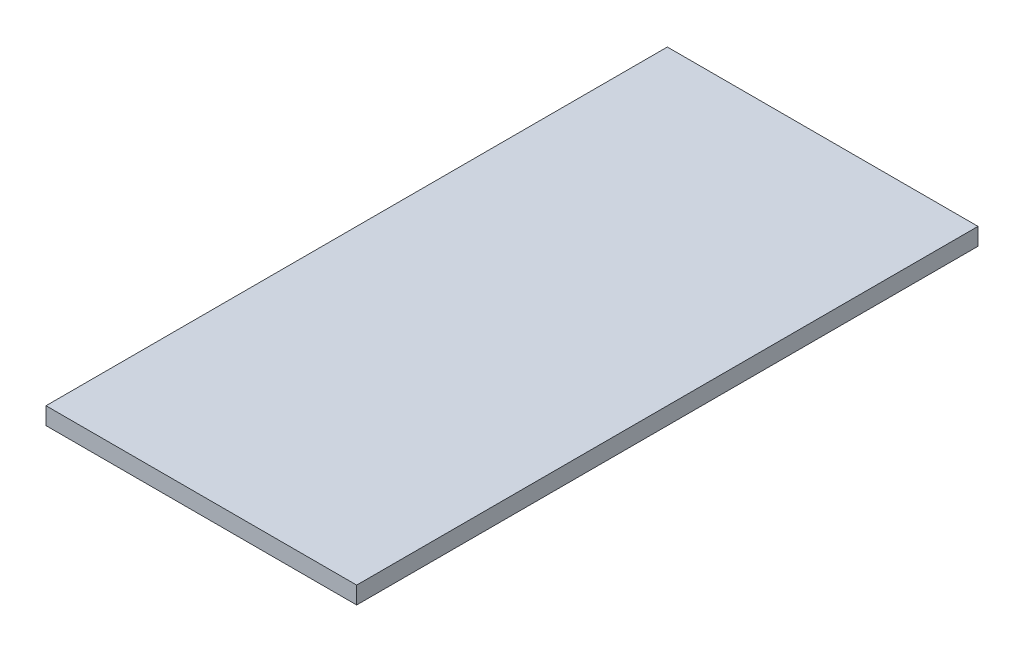
ISO-10303-21;
HEADER;
FILE_DESCRIPTION(('STEP AP214'),'2;1');
FILE_NAME('part.step','',(''),(''),'','','');
FILE_SCHEMA(('AUTOMOTIVE_DESIGN { 1 0 10303 214 1 1 1 1 }'));
ENDSEC;
DATA;
#1=APPLICATION_CONTEXT('core data for automotive mechanical design processes');
#2=APPLICATION_PROTOCOL_DEFINITION('international standard','automotive_design',2000,#1);
#3=PRODUCT_CONTEXT('',#1,'mechanical');
#4=PRODUCT('Part','Part','',(#3));
#5=PRODUCT_RELATED_PRODUCT_CATEGORY('part','',(#4));
#6=PRODUCT_DEFINITION_FORMATION('','',#4);
#7=PRODUCT_DEFINITION_CONTEXT('part definition',#1,'design');
#8=PRODUCT_DEFINITION('design','',#6,#7);
#9=PRODUCT_DEFINITION_SHAPE('','',#8);
#10=(LENGTH_UNIT() NAMED_UNIT(*) SI_UNIT(.MILLI.,.METRE.));
#11=(NAMED_UNIT(*) PLANE_ANGLE_UNIT() SI_UNIT($,.RADIAN.));
#12=(NAMED_UNIT(*) SI_UNIT($,.STERADIAN.) SOLID_ANGLE_UNIT());
#13=UNCERTAINTY_MEASURE_WITH_UNIT(LENGTH_MEASURE(1.E-05),#10,'distance_accuracy_value','');
#14=(GEOMETRIC_REPRESENTATION_CONTEXT(3) GLOBAL_UNCERTAINTY_ASSIGNED_CONTEXT((#13)) GLOBAL_UNIT_ASSIGNED_CONTEXT((#10,
#11,#12)) REPRESENTATION_CONTEXT('',''));
#15=CARTESIAN_POINT('',(0.,0.,0.));
#16=DIRECTION('',(0.,0.,1.));
#17=DIRECTION('',(1.,0.,0.));
#18=AXIS2_PLACEMENT_3D('',#15,#16,#17);
#19=CARTESIAN_POINT('',(-27.,3.,54.));
#20=DIRECTION('',(1.,0.,0.));
#21=DIRECTION('',(0.,0.,-1.));
#22=AXIS2_PLACEMENT_3D('',#19,#20,#21);
#23=PLANE('',#22);
#24=DIRECTION('',(0.,0.,1.));
#25=VECTOR('',#24,1.);
#26=CARTESIAN_POINT('',(-27.,0.,54.));
#27=LINE('',#26,#25);
#28=CARTESIAN_POINT('',(-27.,0.,-54.));
#29=VERTEX_POINT('',#28);
#30=CARTESIAN_POINT('',(-27.,0.,54.));
#31=VERTEX_POINT('',#30);
#32=EDGE_CURVE('E100',#29,#31,#27,.T.);
#33=ORIENTED_EDGE('',*,*,#32,.T.);
#34=DIRECTION('',(0.,-1.,0.));
#35=VECTOR('',#34,1.);
#36=CARTESIAN_POINT('',(-27.,3.,54.));
#37=LINE('',#36,#35);
#38=CARTESIAN_POINT('',(-27.,3.,54.));
#39=VERTEX_POINT('',#38);
#40=EDGE_CURVE('E11',#39,#31,#37,.T.);
#41=ORIENTED_EDGE('',*,*,#40,.F.);
#42=DIRECTION('',(0.,0.,1.));
#43=VECTOR('',#42,1.);
#44=CARTESIAN_POINT('',(-27.,3.,54.));
#45=LINE('',#44,#43);
#46=CARTESIAN_POINT('',(-27.,3.,-54.));
#47=VERTEX_POINT('',#46);
#48=EDGE_CURVE('E88',#47,#39,#45,.T.);
#49=ORIENTED_EDGE('',*,*,#48,.F.);
#50=DIRECTION('',(0.,-1.,0.));
#51=VECTOR('',#50,1.);
#52=CARTESIAN_POINT('',(-27.,3.,-54.));
#53=LINE('',#52,#51);
#54=EDGE_CURVE('E96',#47,#29,#53,.T.);
#55=ORIENTED_EDGE('',*,*,#54,.T.);
#56=EDGE_LOOP('',(#33,#41,#49,#55));
#57=FACE_BOUND('',#56,.T.);
#58=ADVANCED_FACE('F37',(#57),#23,.F.);
#59=CARTESIAN_POINT('',(27.,3.,54.));
#60=DIRECTION('',(0.,0.,-1.));
#61=DIRECTION('',(-1.,0.,0.));
#62=AXIS2_PLACEMENT_3D('',#59,#60,#61);
#63=PLANE('',#62);
#64=DIRECTION('',(1.,0.,0.));
#65=VECTOR('',#64,1.);
#66=CARTESIAN_POINT('',(27.,0.,54.));
#67=LINE('',#66,#65);
#68=CARTESIAN_POINT('',(27.,0.,54.));
#69=VERTEX_POINT('',#68);
#70=EDGE_CURVE('E92',#31,#69,#67,.T.);
#71=ORIENTED_EDGE('',*,*,#70,.T.);
#72=DIRECTION('',(0.,-1.,0.));
#73=VECTOR('',#72,1.);
#74=CARTESIAN_POINT('',(27.,3.,54.));
#75=LINE('',#74,#73);
#76=CARTESIAN_POINT('',(27.,3.,54.));
#77=VERTEX_POINT('',#76);
#78=EDGE_CURVE('E45',#77,#69,#75,.T.);
#79=ORIENTED_EDGE('',*,*,#78,.F.);
#80=DIRECTION('',(1.,0.,0.));
#81=VECTOR('',#80,1.);
#82=CARTESIAN_POINT('',(27.,3.,54.));
#83=LINE('',#82,#81);
#84=EDGE_CURVE('E83',#39,#77,#83,.T.);
#85=ORIENTED_EDGE('',*,*,#84,.F.);
#86=ORIENTED_EDGE('',*,*,#40,.T.);
#87=EDGE_LOOP('',(#71,#79,#85,#86));
#88=FACE_BOUND('',#87,.T.);
#89=ADVANCED_FACE('F91',(#88),#63,.F.);
#90=CARTESIAN_POINT('',(27.,3.,54.));
#91=DIRECTION('',(-1.,0.,0.));
#92=DIRECTION('',(0.,0.,1.));
#93=AXIS2_PLACEMENT_3D('',#90,#91,#92);
#94=PLANE('',#93);
#95=DIRECTION('',(0.,0.,-1.));
#96=VECTOR('',#95,1.);
#97=CARTESIAN_POINT('',(27.,0.,54.));
#98=LINE('',#97,#96);
#99=CARTESIAN_POINT('',(27.,0.,-54.));
#100=VERTEX_POINT('',#99);
#101=EDGE_CURVE('E70',#69,#100,#98,.T.);
#102=ORIENTED_EDGE('',*,*,#101,.T.);
#103=DIRECTION('',(0.,-1.,0.));
#104=VECTOR('',#103,1.);
#105=CARTESIAN_POINT('',(27.,3.,-54.));
#106=LINE('',#105,#104);
#107=CARTESIAN_POINT('',(27.,3.,-54.));
#108=VERTEX_POINT('',#107);
#109=EDGE_CURVE('E93',#108,#100,#106,.T.);
#110=ORIENTED_EDGE('',*,*,#109,.F.);
#111=DIRECTION('',(0.,0.,-1.));
#112=VECTOR('',#111,1.);
#113=CARTESIAN_POINT('',(27.,3.,54.));
#114=LINE('',#113,#112);
#115=EDGE_CURVE('E86',#77,#108,#114,.T.);
#116=ORIENTED_EDGE('',*,*,#115,.F.);
#117=ORIENTED_EDGE('',*,*,#78,.T.);
#118=EDGE_LOOP('',(#102,#110,#116,#117));
#119=FACE_BOUND('',#118,.T.);
#120=ADVANCED_FACE('F94',(#119),#94,.F.);
#121=CARTESIAN_POINT('',(27.,3.,-54.));
#122=DIRECTION('',(0.,0.,1.));
#123=DIRECTION('',(1.,0.,0.));
#124=AXIS2_PLACEMENT_3D('',#121,#122,#123);
#125=PLANE('',#124);
#126=DIRECTION('',(-1.,0.,0.));
#127=VECTOR('',#126,1.);
#128=CARTESIAN_POINT('',(27.,0.,-54.));
#129=LINE('',#128,#127);
#130=EDGE_CURVE('E76',#100,#29,#129,.T.);
#131=ORIENTED_EDGE('',*,*,#130,.T.);
#132=ORIENTED_EDGE('',*,*,#54,.F.);
#133=DIRECTION('',(-1.,0.,0.));
#134=VECTOR('',#133,1.);
#135=CARTESIAN_POINT('',(27.,3.,-54.));
#136=LINE('',#135,#134);
#137=EDGE_CURVE('E53',#108,#47,#136,.T.);
#138=ORIENTED_EDGE('',*,*,#137,.F.);
#139=ORIENTED_EDGE('',*,*,#109,.T.);
#140=EDGE_LOOP('',(#131,#132,#138,#139));
#141=FACE_BOUND('',#140,.T.);
#142=ADVANCED_FACE('F107',(#141),#125,.F.);
#143=CARTESIAN_POINT('',(0.,3.,0.));
#144=DIRECTION('',(0.,1.,0.));
#145=DIRECTION('',(0.,0.,1.));
#146=AXIS2_PLACEMENT_3D('',#143,#144,#145);
#147=PLANE('',#146);
#148=ORIENTED_EDGE('',*,*,#48,.T.);
#149=ORIENTED_EDGE('',*,*,#84,.T.);
#150=ORIENTED_EDGE('',*,*,#115,.T.);
#151=ORIENTED_EDGE('',*,*,#137,.T.);
#152=EDGE_LOOP('',(#148,#149,#150,#151));
#153=FACE_BOUND('',#152,.T.);
#154=ADVANCED_FACE('F84',(#153),#147,.T.);
#155=CARTESIAN_POINT('',(0.,0.,0.));
#156=DIRECTION('',(0.,1.,0.));
#157=DIRECTION('',(0.,0.,1.));
#158=AXIS2_PLACEMENT_3D('',#155,#156,#157);
#159=PLANE('',#158);
#160=ORIENTED_EDGE('',*,*,#32,.F.);
#161=ORIENTED_EDGE('',*,*,#130,.F.);
#162=ORIENTED_EDGE('',*,*,#101,.F.);
#163=ORIENTED_EDGE('',*,*,#70,.F.);
#164=EDGE_LOOP('',(#160,#161,#162,#163));
#165=FACE_BOUND('',#164,.T.);
#166=ADVANCED_FACE('F110',(#165),#159,.F.);
#167=CLOSED_SHELL('',(#58,#89,#120,#142,#154,#166));
#168=MANIFOLD_SOLID_BREP('B2',#167);
#169=ADVANCED_BREP_SHAPE_REPRESENTATION('',(#18,#168),#14);
#170=SHAPE_DEFINITION_REPRESENTATION(#9,#169);
ENDSEC;
END-ISO-10303-21;
